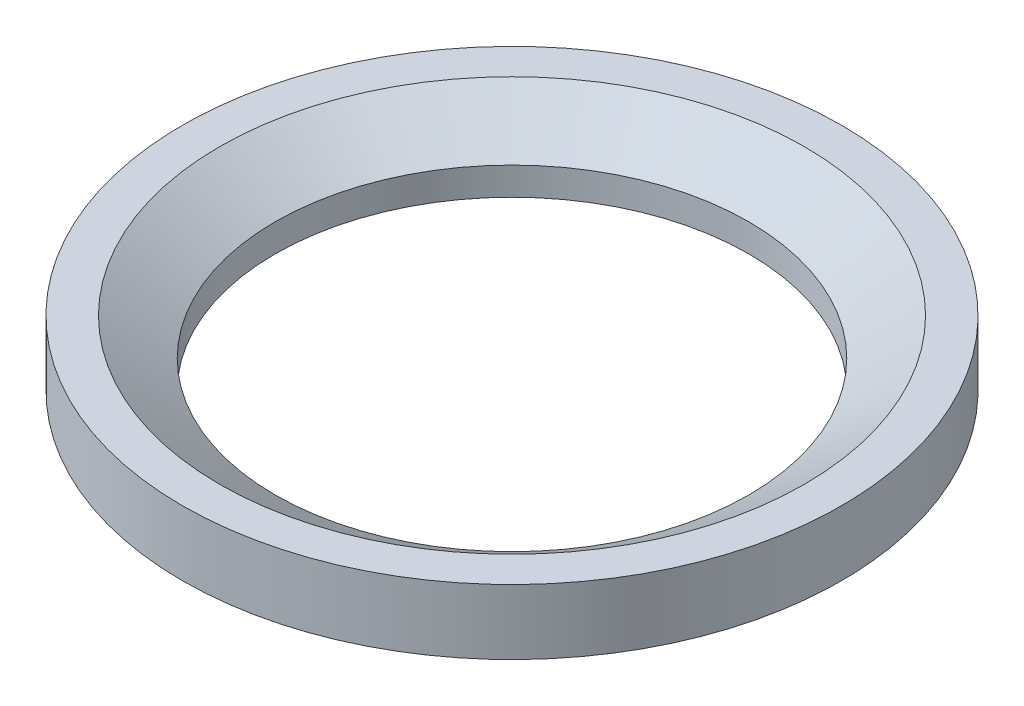
ISO-10303-21;
HEADER;
FILE_DESCRIPTION(('STEP AP214'),'2;1');
FILE_NAME('part.step','',(''),(''),'','','');
FILE_SCHEMA(('AUTOMOTIVE_DESIGN { 1 0 10303 214 1 1 1 1 }'));
ENDSEC;
DATA;
#1=APPLICATION_CONTEXT('core data for automotive mechanical design processes');
#2=APPLICATION_PROTOCOL_DEFINITION('international standard','automotive_design',2000,#1);
#3=PRODUCT_CONTEXT('',#1,'mechanical');
#4=PRODUCT('Part','Part','',(#3));
#5=PRODUCT_RELATED_PRODUCT_CATEGORY('part','',(#4));
#6=PRODUCT_DEFINITION_FORMATION('','',#4);
#7=PRODUCT_DEFINITION_CONTEXT('part definition',#1,'design');
#8=PRODUCT_DEFINITION('design','',#6,#7);
#9=PRODUCT_DEFINITION_SHAPE('','',#8);
#10=(LENGTH_UNIT() NAMED_UNIT(*) SI_UNIT(.MILLI.,.METRE.));
#11=(NAMED_UNIT(*) PLANE_ANGLE_UNIT() SI_UNIT($,.RADIAN.));
#12=(NAMED_UNIT(*) SI_UNIT($,.STERADIAN.) SOLID_ANGLE_UNIT());
#13=UNCERTAINTY_MEASURE_WITH_UNIT(LENGTH_MEASURE(1.E-05),#10,'distance_accuracy_value','');
#14=(GEOMETRIC_REPRESENTATION_CONTEXT(3) GLOBAL_UNCERTAINTY_ASSIGNED_CONTEXT((#13)) GLOBAL_UNIT_ASSIGNED_CONTEXT((#10,
#11,#12)) REPRESENTATION_CONTEXT('',''));
#15=CARTESIAN_POINT('',(0.,0.,0.));
#16=DIRECTION('',(0.,0.,1.));
#17=DIRECTION('',(1.,0.,0.));
#18=AXIS2_PLACEMENT_3D('',#15,#16,#17);
#19=CARTESIAN_POINT('',(0.,7.,0.));
#20=DIRECTION('',(0.,1.,0.));
#21=DIRECTION('',(0.,0.,1.));
#22=AXIS2_PLACEMENT_3D('',#19,#20,#21);
#23=PLANE('',#22);
#24=CARTESIAN_POINT('',(0.,7.,0.));
#25=DIRECTION('',(0.,1.,0.));
#26=DIRECTION('',(0.,0.,1.));
#27=AXIS2_PLACEMENT_3D('',#24,#25,#26);
#28=CIRCLE('',#27,31.5);
#29=CARTESIAN_POINT('',(0.,7.,31.5));
#30=VERTEX_POINT('',#29);
#31=EDGE_CURVE('E10',#30,#30,#28,.F.);
#32=ORIENTED_EDGE('',*,*,#31,.T.);
#33=EDGE_LOOP('',(#32));
#34=FACE_BOUND('',#33,.T.);
#35=CARTESIAN_POINT('',(0.,7.,0.));
#36=DIRECTION('',(0.,1.,0.));
#37=DIRECTION('',(0.,0.,1.));
#38=AXIS2_PLACEMENT_3D('',#35,#36,#37);
#39=CIRCLE('',#38,35.5);
#40=CARTESIAN_POINT('',(0.,7.,35.5));
#41=VERTEX_POINT('',#40);
#42=EDGE_CURVE('E53',#41,#41,#39,.T.);
#43=ORIENTED_EDGE('',*,*,#42,.T.);
#44=EDGE_LOOP('',(#43));
#45=FACE_BOUND('',#44,.T.);
#46=ADVANCED_FACE('F39',(#34,#45),#23,.T.);
#47=CARTESIAN_POINT('',(0.,0.,0.));
#48=DIRECTION('',(0.,1.,0.));
#49=DIRECTION('',(0.,0.,1.));
#50=AXIS2_PLACEMENT_3D('',#47,#48,#49);
#51=PLANE('',#50);
#52=CARTESIAN_POINT('',(0.,0.,0.));
#53=DIRECTION('',(0.,1.,0.));
#54=DIRECTION('',(0.,0.,1.));
#55=AXIS2_PLACEMENT_3D('',#52,#53,#54);
#56=CIRCLE('',#55,35.5);
#57=CARTESIAN_POINT('',(0.,0.,35.5));
#58=VERTEX_POINT('',#57);
#59=EDGE_CURVE('E58',#58,#58,#56,.T.);
#60=ORIENTED_EDGE('',*,*,#59,.F.);
#61=EDGE_LOOP('',(#60));
#62=FACE_BOUND('',#61,.T.);
#63=CARTESIAN_POINT('',(0.,0.,0.));
#64=DIRECTION('',(0.,1.,0.));
#65=DIRECTION('',(0.,0.,1.));
#66=AXIS2_PLACEMENT_3D('',#63,#64,#65);
#67=CIRCLE('',#66,25.5);
#68=CARTESIAN_POINT('',(0.,0.,25.5));
#69=VERTEX_POINT('',#68);
#70=EDGE_CURVE('E63',#69,#69,#67,.T.);
#71=ORIENTED_EDGE('',*,*,#70,.T.);
#72=EDGE_LOOP('',(#71));
#73=FACE_BOUND('',#72,.T.);
#74=ADVANCED_FACE('F69',(#62,#73),#51,.F.);
#75=CARTESIAN_POINT('',(0.,7.,0.));
#76=DIRECTION('',(0.,-1.,0.));
#77=DIRECTION('',(0.,0.,-1.));
#78=AXIS2_PLACEMENT_3D('',#75,#76,#77);
#79=CYLINDRICAL_SURFACE('',#78,35.5);
#80=ORIENTED_EDGE('',*,*,#42,.F.);
#81=EDGE_LOOP('',(#80));
#82=FACE_BOUND('',#81,.T.);
#83=ORIENTED_EDGE('',*,*,#59,.T.);
#84=EDGE_LOOP('',(#83));
#85=FACE_BOUND('',#84,.T.);
#86=ADVANCED_FACE('F73',(#82,#85),#79,.T.);
#87=CARTESIAN_POINT('',(0.,7.,0.));
#88=DIRECTION('',(0.,-1.,0.));
#89=DIRECTION('',(0.,0.,-1.));
#90=AXIS2_PLACEMENT_3D('',#87,#88,#89);
#91=CYLINDRICAL_SURFACE('',#90,25.5);
#92=CARTESIAN_POINT('',(0.,2.99999999999999,0.));
#93=DIRECTION('',(0.,1.,0.));
#94=DIRECTION('',(0.,0.,1.));
#95=AXIS2_PLACEMENT_3D('',#92,#93,#94);
#96=CIRCLE('',#95,25.5);
#97=CARTESIAN_POINT('',(0.,2.99999999999999,25.5));
#98=VERTEX_POINT('',#97);
#99=EDGE_CURVE('E48',#98,#98,#96,.T.);
#100=ORIENTED_EDGE('',*,*,#99,.T.);
#101=EDGE_LOOP('',(#100));
#102=FACE_BOUND('',#101,.T.);
#103=ORIENTED_EDGE('',*,*,#70,.F.);
#104=EDGE_LOOP('',(#103));
#105=FACE_BOUND('',#104,.T.);
#106=ADVANCED_FACE('F71',(#102,#105),#91,.F.);
#107=CARTESIAN_POINT('',(0.,2.99999999999999,0.));
#108=DIRECTION('',(0.,1.,0.));
#109=DIRECTION('',(0.,0.,1.));
#110=AXIS2_PLACEMENT_3D('',#107,#108,#109);
#111=CONICAL_SURFACE('',#110,25.5,0.982793723247331);
#112=ORIENTED_EDGE('',*,*,#31,.F.);
#113=EDGE_LOOP('',(#112));
#114=FACE_BOUND('',#113,.T.);
#115=ORIENTED_EDGE('',*,*,#99,.F.);
#116=EDGE_LOOP('',(#115));
#117=FACE_BOUND('',#116,.T.);
#118=ADVANCED_FACE('F42',(#114,#117),#111,.F.);
#119=CLOSED_SHELL('',(#46,#74,#86,#106,#118));
#120=MANIFOLD_SOLID_BREP('B2',#119);
#121=ADVANCED_BREP_SHAPE_REPRESENTATION('',(#18,#120),#14);
#122=SHAPE_DEFINITION_REPRESENTATION(#9,#121);
ENDSEC;
END-ISO-10303-21;
